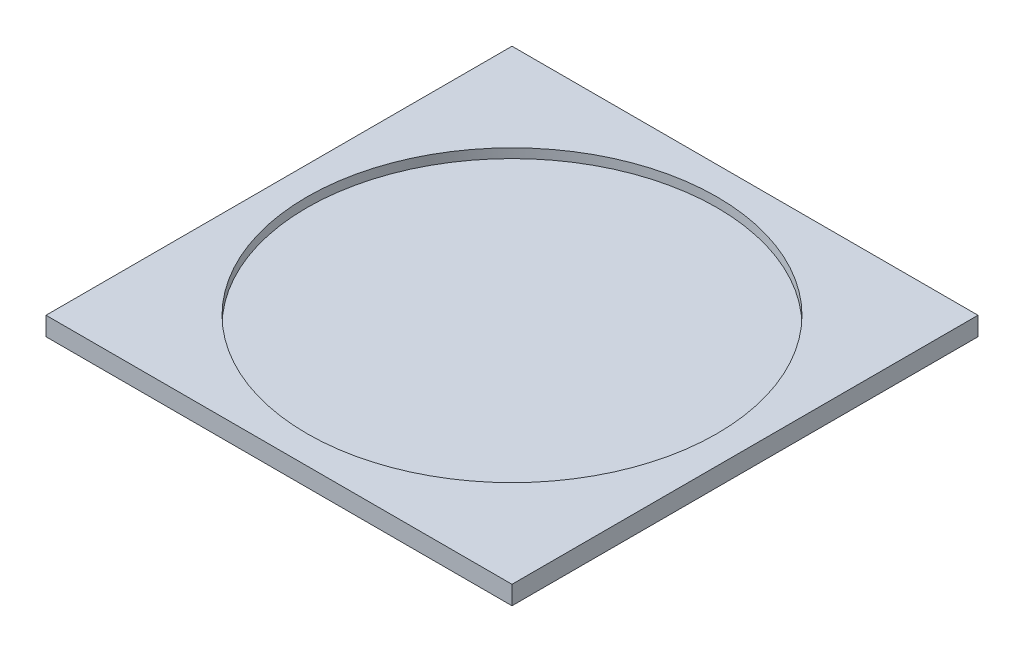
ISO-10303-21;
HEADER;
FILE_DESCRIPTION(('STEP AP214'),'2;1');
FILE_NAME('part.step','',(''),(''),'','','');
FILE_SCHEMA(('AUTOMOTIVE_DESIGN { 1 0 10303 214 1 1 1 1 }'));
ENDSEC;
DATA;
#1=APPLICATION_CONTEXT('core data for automotive mechanical design processes');
#2=APPLICATION_PROTOCOL_DEFINITION('international standard','automotive_design',2000,#1);
#3=PRODUCT_CONTEXT('',#1,'mechanical');
#4=PRODUCT('Part','Part','',(#3));
#5=PRODUCT_RELATED_PRODUCT_CATEGORY('part','',(#4));
#6=PRODUCT_DEFINITION_FORMATION('','',#4);
#7=PRODUCT_DEFINITION_CONTEXT('part definition',#1,'design');
#8=PRODUCT_DEFINITION('design','',#6,#7);
#9=PRODUCT_DEFINITION_SHAPE('','',#8);
#10=(LENGTH_UNIT() NAMED_UNIT(*) SI_UNIT(.MILLI.,.METRE.));
#11=(NAMED_UNIT(*) PLANE_ANGLE_UNIT() SI_UNIT($,.RADIAN.));
#12=(NAMED_UNIT(*) SI_UNIT($,.STERADIAN.) SOLID_ANGLE_UNIT());
#13=UNCERTAINTY_MEASURE_WITH_UNIT(LENGTH_MEASURE(1.E-05),#10,'distance_accuracy_value','');
#14=(GEOMETRIC_REPRESENTATION_CONTEXT(3) GLOBAL_UNCERTAINTY_ASSIGNED_CONTEXT((#13)) GLOBAL_UNIT_ASSIGNED_CONTEXT((#10,
#11,#12)) REPRESENTATION_CONTEXT('',''));
#15=CARTESIAN_POINT('',(0.,0.,0.));
#16=DIRECTION('',(0.,0.,1.));
#17=DIRECTION('',(1.,0.,0.));
#18=AXIS2_PLACEMENT_3D('',#15,#16,#17);
#19=CARTESIAN_POINT('',(125.,10.,125.));
#20=DIRECTION('',(-1.,0.,0.));
#21=DIRECTION('',(0.,0.,1.));
#22=AXIS2_PLACEMENT_3D('',#19,#20,#21);
#23=PLANE('',#22);
#24=DIRECTION('',(0.,0.,-1.));
#25=VECTOR('',#24,1.);
#26=CARTESIAN_POINT('',(125.,0.,125.));
#27=LINE('',#26,#25);
#28=CARTESIAN_POINT('',(125.,0.,125.));
#29=VERTEX_POINT('',#28);
#30=CARTESIAN_POINT('',(125.,0.,-125.));
#31=VERTEX_POINT('',#30);
#32=EDGE_CURVE('E113',#29,#31,#27,.T.);
#33=ORIENTED_EDGE('',*,*,#32,.T.);
#34=DIRECTION('',(0.,-1.,0.));
#35=VECTOR('',#34,1.);
#36=CARTESIAN_POINT('',(125.,10.,-125.));
#37=LINE('',#36,#35);
#38=CARTESIAN_POINT('',(125.,10.,-125.));
#39=VERTEX_POINT('',#38);
#40=EDGE_CURVE('E11',#39,#31,#37,.T.);
#41=ORIENTED_EDGE('',*,*,#40,.F.);
#42=DIRECTION('',(0.,0.,-1.));
#43=VECTOR('',#42,1.);
#44=CARTESIAN_POINT('',(125.,10.,125.));
#45=LINE('',#44,#43);
#46=CARTESIAN_POINT('',(125.,10.,125.));
#47=VERTEX_POINT('',#46);
#48=EDGE_CURVE('E97',#47,#39,#45,.T.);
#49=ORIENTED_EDGE('',*,*,#48,.F.);
#50=DIRECTION('',(0.,-1.,0.));
#51=VECTOR('',#50,1.);
#52=CARTESIAN_POINT('',(125.,10.,125.));
#53=LINE('',#52,#51);
#54=EDGE_CURVE('E109',#47,#29,#53,.T.);
#55=ORIENTED_EDGE('',*,*,#54,.T.);
#56=EDGE_LOOP('',(#33,#41,#49,#55));
#57=FACE_BOUND('',#56,.T.);
#58=ADVANCED_FACE('F45',(#57),#23,.F.);
#59=CARTESIAN_POINT('',(-125.,10.,-125.));
#60=DIRECTION('',(0.,0.,1.));
#61=DIRECTION('',(1.,0.,0.));
#62=AXIS2_PLACEMENT_3D('',#59,#60,#61);
#63=PLANE('',#62);
#64=DIRECTION('',(-1.,0.,0.));
#65=VECTOR('',#64,1.);
#66=CARTESIAN_POINT('',(-125.,0.,-125.));
#67=LINE('',#66,#65);
#68=CARTESIAN_POINT('',(-125.,0.,-125.));
#69=VERTEX_POINT('',#68);
#70=EDGE_CURVE('E102',#31,#69,#67,.T.);
#71=ORIENTED_EDGE('',*,*,#70,.T.);
#72=DIRECTION('',(0.,-1.,0.));
#73=VECTOR('',#72,1.);
#74=CARTESIAN_POINT('',(-125.,10.,-125.));
#75=LINE('',#74,#73);
#76=CARTESIAN_POINT('',(-125.,10.,-125.));
#77=VERTEX_POINT('',#76);
#78=EDGE_CURVE('E54',#77,#69,#75,.T.);
#79=ORIENTED_EDGE('',*,*,#78,.F.);
#80=DIRECTION('',(-1.,0.,0.));
#81=VECTOR('',#80,1.);
#82=CARTESIAN_POINT('',(-125.,10.,-125.));
#83=LINE('',#82,#81);
#84=EDGE_CURVE('E92',#39,#77,#83,.T.);
#85=ORIENTED_EDGE('',*,*,#84,.F.);
#86=ORIENTED_EDGE('',*,*,#40,.T.);
#87=EDGE_LOOP('',(#71,#79,#85,#86));
#88=FACE_BOUND('',#87,.T.);
#89=ADVANCED_FACE('F101',(#88),#63,.F.);
#90=CARTESIAN_POINT('',(-125.,10.,125.));
#91=DIRECTION('',(1.,0.,0.));
#92=DIRECTION('',(0.,0.,-1.));
#93=AXIS2_PLACEMENT_3D('',#90,#91,#92);
#94=PLANE('',#93);
#95=DIRECTION('',(0.,0.,1.));
#96=VECTOR('',#95,1.);
#97=CARTESIAN_POINT('',(-125.,0.,125.));
#98=LINE('',#97,#96);
#99=CARTESIAN_POINT('',(-125.,0.,125.));
#100=VERTEX_POINT('',#99);
#101=EDGE_CURVE('E79',#69,#100,#98,.T.);
#102=ORIENTED_EDGE('',*,*,#101,.T.);
#103=DIRECTION('',(0.,-1.,0.));
#104=VECTOR('',#103,1.);
#105=CARTESIAN_POINT('',(-125.,10.,125.));
#106=LINE('',#105,#104);
#107=CARTESIAN_POINT('',(-125.,10.,125.));
#108=VERTEX_POINT('',#107);
#109=EDGE_CURVE('E104',#108,#100,#106,.T.);
#110=ORIENTED_EDGE('',*,*,#109,.F.);
#111=DIRECTION('',(0.,0.,1.));
#112=VECTOR('',#111,1.);
#113=CARTESIAN_POINT('',(-125.,10.,125.));
#114=LINE('',#113,#112);
#115=EDGE_CURVE('E95',#77,#108,#114,.T.);
#116=ORIENTED_EDGE('',*,*,#115,.F.);
#117=ORIENTED_EDGE('',*,*,#78,.T.);
#118=EDGE_LOOP('',(#102,#110,#116,#117));
#119=FACE_BOUND('',#118,.T.);
#120=ADVANCED_FACE('F105',(#119),#94,.F.);
#121=CARTESIAN_POINT('',(-125.,10.,125.));
#122=DIRECTION('',(0.,0.,-1.));
#123=DIRECTION('',(-1.,0.,0.));
#124=AXIS2_PLACEMENT_3D('',#121,#122,#123);
#125=PLANE('',#124);
#126=DIRECTION('',(1.,0.,0.));
#127=VECTOR('',#126,1.);
#128=CARTESIAN_POINT('',(-125.,0.,125.));
#129=LINE('',#128,#127);
#130=EDGE_CURVE('E85',#100,#29,#129,.T.);
#131=ORIENTED_EDGE('',*,*,#130,.T.);
#132=ORIENTED_EDGE('',*,*,#54,.F.);
#133=DIRECTION('',(1.,0.,0.));
#134=VECTOR('',#133,1.);
#135=CARTESIAN_POINT('',(-125.,10.,125.));
#136=LINE('',#135,#134);
#137=EDGE_CURVE('E62',#108,#47,#136,.T.);
#138=ORIENTED_EDGE('',*,*,#137,.F.);
#139=ORIENTED_EDGE('',*,*,#109,.T.);
#140=EDGE_LOOP('',(#131,#132,#138,#139));
#141=FACE_BOUND('',#140,.T.);
#142=ADVANCED_FACE('F127',(#141),#125,.F.);
#143=CARTESIAN_POINT('',(0.,10.,0.));
#144=DIRECTION('',(0.,-1.,0.));
#145=DIRECTION('',(0.,0.,-1.));
#146=AXIS2_PLACEMENT_3D('',#143,#144,#145);
#147=PLANE('',#146);
#148=CARTESIAN_POINT('',(0.,10.,0.));
#149=DIRECTION('',(0.,1.,0.));
#150=DIRECTION('',(0.,0.,1.));
#151=AXIS2_PLACEMENT_3D('',#148,#149,#150);
#152=CIRCLE('',#151,110.);
#153=CARTESIAN_POINT('',(0.,10.,110.));
#154=VERTEX_POINT('',#153);
#155=EDGE_CURVE('E134',#154,#154,#152,.T.);
#156=ORIENTED_EDGE('',*,*,#155,.F.);
#157=EDGE_LOOP('',(#156));
#158=FACE_BOUND('',#157,.T.);
#159=ORIENTED_EDGE('',*,*,#48,.T.);
#160=ORIENTED_EDGE('',*,*,#84,.T.);
#161=ORIENTED_EDGE('',*,*,#115,.T.);
#162=ORIENTED_EDGE('',*,*,#137,.T.);
#163=EDGE_LOOP('',(#159,#160,#161,#162));
#164=FACE_BOUND('',#163,.T.);
#165=ADVANCED_FACE('F93',(#158,#164),#147,.F.);
#166=CARTESIAN_POINT('',(0.,0.,0.));
#167=DIRECTION('',(0.,-1.,0.));
#168=DIRECTION('',(0.,0.,-1.));
#169=AXIS2_PLACEMENT_3D('',#166,#167,#168);
#170=PLANE('',#169);
#171=ORIENTED_EDGE('',*,*,#32,.F.);
#172=ORIENTED_EDGE('',*,*,#130,.F.);
#173=ORIENTED_EDGE('',*,*,#101,.F.);
#174=ORIENTED_EDGE('',*,*,#70,.F.);
#175=EDGE_LOOP('',(#171,#172,#173,#174));
#176=FACE_BOUND('',#175,.T.);
#177=ADVANCED_FACE('F130',(#176),#170,.T.);
#178=CARTESIAN_POINT('',(0.,5.,0.));
#179=DIRECTION('',(0.,1.,0.));
#180=DIRECTION('',(0.,0.,1.));
#181=AXIS2_PLACEMENT_3D('',#178,#179,#180);
#182=CYLINDRICAL_SURFACE('',#181,110.);
#183=CARTESIAN_POINT('',(0.,5.,0.));
#184=DIRECTION('',(0.,1.,0.));
#185=DIRECTION('',(0.,0.,1.));
#186=AXIS2_PLACEMENT_3D('',#183,#184,#185);
#187=CIRCLE('',#186,110.);
#188=CARTESIAN_POINT('',(0.,5.,110.));
#189=VERTEX_POINT('',#188);
#190=EDGE_CURVE('E117',#189,#189,#187,.T.);
#191=ORIENTED_EDGE('',*,*,#190,.F.);
#192=EDGE_LOOP('',(#191));
#193=FACE_BOUND('',#192,.T.);
#194=ORIENTED_EDGE('',*,*,#155,.T.);
#195=EDGE_LOOP('',(#194));
#196=FACE_BOUND('',#195,.T.);
#197=ADVANCED_FACE('F144',(#193,#196),#182,.F.);
#198=CARTESIAN_POINT('',(0.,5.,0.));
#199=DIRECTION('',(0.,1.,0.));
#200=DIRECTION('',(0.,0.,1.));
#201=AXIS2_PLACEMENT_3D('',#198,#199,#200);
#202=PLANE('',#201);
#203=ORIENTED_EDGE('',*,*,#190,.T.);
#204=EDGE_LOOP('',(#203));
#205=FACE_BOUND('',#204,.T.);
#206=ADVANCED_FACE('F142',(#205),#202,.T.);
#207=CLOSED_SHELL('',(#58,#89,#120,#142,#165,#177,#197,#206));
#208=MANIFOLD_SOLID_BREP('B2',#207);
#209=ADVANCED_BREP_SHAPE_REPRESENTATION('',(#18,#208),#14);
#210=SHAPE_DEFINITION_REPRESENTATION(#9,#209);
ENDSEC;
END-ISO-10303-21;
